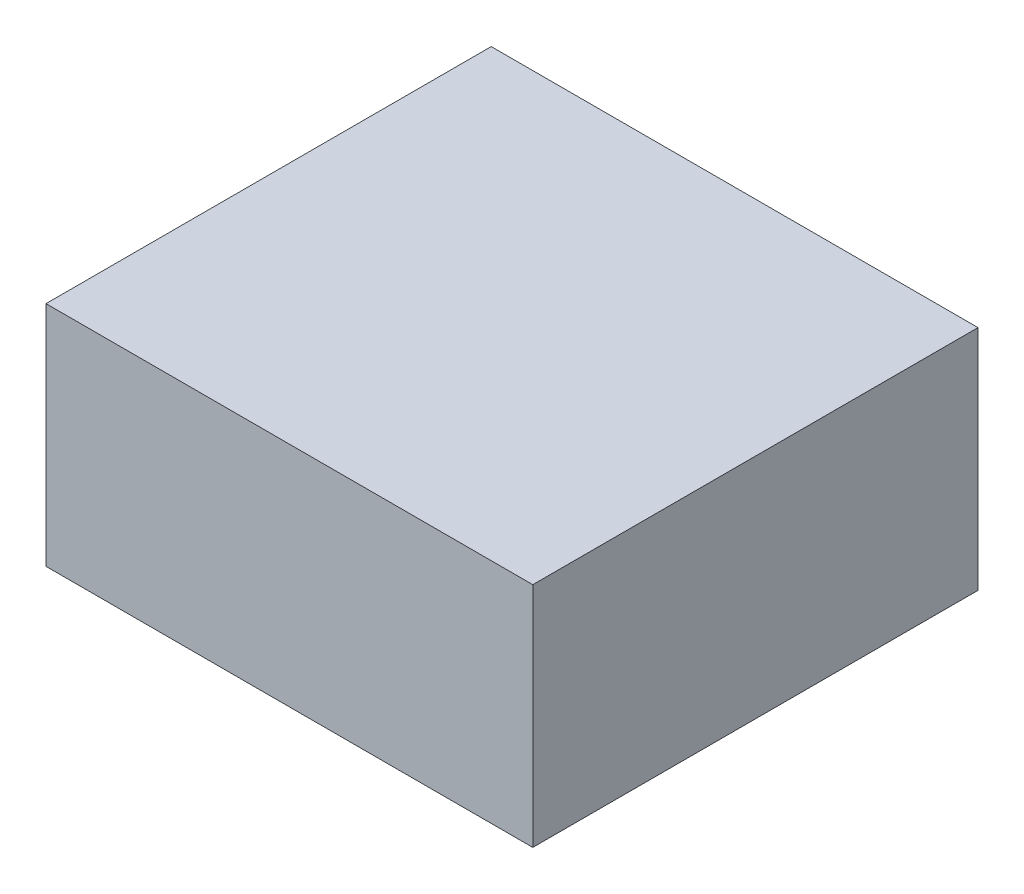
ISO-10303-21;
HEADER;
FILE_DESCRIPTION(('STEP AP214'),'2;1');
FILE_NAME('part.step','',(''),(''),'','','');
FILE_SCHEMA(('AUTOMOTIVE_DESIGN { 1 0 10303 214 1 1 1 1 }'));
ENDSEC;
DATA;
#1=APPLICATION_CONTEXT('core data for automotive mechanical design processes');
#2=APPLICATION_PROTOCOL_DEFINITION('international standard','automotive_design',2000,#1);
#3=PRODUCT_CONTEXT('',#1,'mechanical');
#4=PRODUCT('Part','Part','',(#3));
#5=PRODUCT_RELATED_PRODUCT_CATEGORY('part','',(#4));
#6=PRODUCT_DEFINITION_FORMATION('','',#4);
#7=PRODUCT_DEFINITION_CONTEXT('part definition',#1,'design');
#8=PRODUCT_DEFINITION('design','',#6,#7);
#9=PRODUCT_DEFINITION_SHAPE('','',#8);
#10=(LENGTH_UNIT() NAMED_UNIT(*) SI_UNIT(.MILLI.,.METRE.));
#11=(NAMED_UNIT(*) PLANE_ANGLE_UNIT() SI_UNIT($,.RADIAN.));
#12=(NAMED_UNIT(*) SI_UNIT($,.STERADIAN.) SOLID_ANGLE_UNIT());
#13=UNCERTAINTY_MEASURE_WITH_UNIT(LENGTH_MEASURE(1.E-05),#10,'distance_accuracy_value','');
#14=(GEOMETRIC_REPRESENTATION_CONTEXT(3) GLOBAL_UNCERTAINTY_ASSIGNED_CONTEXT((#13)) GLOBAL_UNIT_ASSIGNED_CONTEXT((#10,
#11,#12)) REPRESENTATION_CONTEXT('',''));
#15=CARTESIAN_POINT('',(0.,0.,0.));
#16=DIRECTION('',(0.,0.,1.));
#17=DIRECTION('',(1.,0.,0.));
#18=AXIS2_PLACEMENT_3D('',#15,#16,#17);
#19=CARTESIAN_POINT('',(-12.3,11.5,11.25));
#20=DIRECTION('',(1.,0.,0.));
#21=DIRECTION('',(0.,0.,-1.));
#22=AXIS2_PLACEMENT_3D('',#19,#20,#21);
#23=PLANE('',#22);
#24=DIRECTION('',(0.,0.,1.));
#25=VECTOR('',#24,1.);
#26=CARTESIAN_POINT('',(-12.3,0.,11.25));
#27=LINE('',#26,#25);
#28=CARTESIAN_POINT('',(-12.3,0.,-11.25));
#29=VERTEX_POINT('',#28);
#30=CARTESIAN_POINT('',(-12.3,0.,11.25));
#31=VERTEX_POINT('',#30);
#32=EDGE_CURVE('E96',#29,#31,#27,.T.);
#33=ORIENTED_EDGE('',*,*,#32,.T.);
#34=DIRECTION('',(0.,-1.,0.));
#35=VECTOR('',#34,1.);
#36=CARTESIAN_POINT('',(-12.3,11.5,11.25));
#37=LINE('',#36,#35);
#38=CARTESIAN_POINT('',(-12.3,11.5,11.25));
#39=VERTEX_POINT('',#38);
#40=EDGE_CURVE('E11',#39,#31,#37,.T.);
#41=ORIENTED_EDGE('',*,*,#40,.F.);
#42=DIRECTION('',(0.,0.,1.));
#43=VECTOR('',#42,1.);
#44=CARTESIAN_POINT('',(-12.3,11.5,11.25));
#45=LINE('',#44,#43);
#46=CARTESIAN_POINT('',(-12.3,11.5,-11.25));
#47=VERTEX_POINT('',#46);
#48=EDGE_CURVE('E84',#47,#39,#45,.T.);
#49=ORIENTED_EDGE('',*,*,#48,.F.);
#50=DIRECTION('',(0.,-1.,0.));
#51=VECTOR('',#50,1.);
#52=CARTESIAN_POINT('',(-12.3,11.5,-11.25));
#53=LINE('',#52,#51);
#54=EDGE_CURVE('E92',#47,#29,#53,.T.);
#55=ORIENTED_EDGE('',*,*,#54,.T.);
#56=EDGE_LOOP('',(#33,#41,#49,#55));
#57=FACE_BOUND('',#56,.T.);
#58=ADVANCED_FACE('F33',(#57),#23,.F.);
#59=CARTESIAN_POINT('',(12.3,11.5,11.25));
#60=DIRECTION('',(0.,0.,-1.));
#61=DIRECTION('',(-1.,0.,0.));
#62=AXIS2_PLACEMENT_3D('',#59,#60,#61);
#63=PLANE('',#62);
#64=DIRECTION('',(1.,0.,0.));
#65=VECTOR('',#64,1.);
#66=CARTESIAN_POINT('',(12.3,0.,11.25));
#67=LINE('',#66,#65);
#68=CARTESIAN_POINT('',(12.3,0.,11.25));
#69=VERTEX_POINT('',#68);
#70=EDGE_CURVE('E88',#31,#69,#67,.T.);
#71=ORIENTED_EDGE('',*,*,#70,.T.);
#72=DIRECTION('',(0.,-1.,0.));
#73=VECTOR('',#72,1.);
#74=CARTESIAN_POINT('',(12.3,11.5,11.25));
#75=LINE('',#74,#73);
#76=CARTESIAN_POINT('',(12.3,11.5,11.25));
#77=VERTEX_POINT('',#76);
#78=EDGE_CURVE('E41',#77,#69,#75,.T.);
#79=ORIENTED_EDGE('',*,*,#78,.F.);
#80=DIRECTION('',(1.,0.,0.));
#81=VECTOR('',#80,1.);
#82=CARTESIAN_POINT('',(12.3,11.5,11.25));
#83=LINE('',#82,#81);
#84=EDGE_CURVE('E79',#39,#77,#83,.T.);
#85=ORIENTED_EDGE('',*,*,#84,.F.);
#86=ORIENTED_EDGE('',*,*,#40,.T.);
#87=EDGE_LOOP('',(#71,#79,#85,#86));
#88=FACE_BOUND('',#87,.T.);
#89=ADVANCED_FACE('F87',(#88),#63,.F.);
#90=CARTESIAN_POINT('',(12.3,11.5,11.25));
#91=DIRECTION('',(-1.,0.,0.));
#92=DIRECTION('',(0.,0.,1.));
#93=AXIS2_PLACEMENT_3D('',#90,#91,#92);
#94=PLANE('',#93);
#95=DIRECTION('',(0.,0.,-1.));
#96=VECTOR('',#95,1.);
#97=CARTESIAN_POINT('',(12.3,0.,11.25));
#98=LINE('',#97,#96);
#99=CARTESIAN_POINT('',(12.3,0.,-11.25));
#100=VERTEX_POINT('',#99);
#101=EDGE_CURVE('E66',#69,#100,#98,.T.);
#102=ORIENTED_EDGE('',*,*,#101,.T.);
#103=DIRECTION('',(0.,-1.,0.));
#104=VECTOR('',#103,1.);
#105=CARTESIAN_POINT('',(12.3,11.5,-11.25));
#106=LINE('',#105,#104);
#107=CARTESIAN_POINT('',(12.3,11.5,-11.25));
#108=VERTEX_POINT('',#107);
#109=EDGE_CURVE('E89',#108,#100,#106,.T.);
#110=ORIENTED_EDGE('',*,*,#109,.F.);
#111=DIRECTION('',(0.,0.,-1.));
#112=VECTOR('',#111,1.);
#113=CARTESIAN_POINT('',(12.3,11.5,11.25));
#114=LINE('',#113,#112);
#115=EDGE_CURVE('E82',#77,#108,#114,.T.);
#116=ORIENTED_EDGE('',*,*,#115,.F.);
#117=ORIENTED_EDGE('',*,*,#78,.T.);
#118=EDGE_LOOP('',(#102,#110,#116,#117));
#119=FACE_BOUND('',#118,.T.);
#120=ADVANCED_FACE('F90',(#119),#94,.F.);
#121=CARTESIAN_POINT('',(12.3,11.5,-11.25));
#122=DIRECTION('',(0.,0.,1.));
#123=DIRECTION('',(1.,0.,0.));
#124=AXIS2_PLACEMENT_3D('',#121,#122,#123);
#125=PLANE('',#124);
#126=DIRECTION('',(-1.,0.,0.));
#127=VECTOR('',#126,1.);
#128=CARTESIAN_POINT('',(12.3,0.,-11.25));
#129=LINE('',#128,#127);
#130=EDGE_CURVE('E72',#100,#29,#129,.T.);
#131=ORIENTED_EDGE('',*,*,#130,.T.);
#132=ORIENTED_EDGE('',*,*,#54,.F.);
#133=DIRECTION('',(-1.,0.,0.));
#134=VECTOR('',#133,1.);
#135=CARTESIAN_POINT('',(12.3,11.5,-11.25));
#136=LINE('',#135,#134);
#137=EDGE_CURVE('E49',#108,#47,#136,.T.);
#138=ORIENTED_EDGE('',*,*,#137,.F.);
#139=ORIENTED_EDGE('',*,*,#109,.T.);
#140=EDGE_LOOP('',(#131,#132,#138,#139));
#141=FACE_BOUND('',#140,.T.);
#142=ADVANCED_FACE('F103',(#141),#125,.F.);
#143=CARTESIAN_POINT('',(0.,11.5,0.));
#144=DIRECTION('',(0.,1.,0.));
#145=DIRECTION('',(0.,0.,1.));
#146=AXIS2_PLACEMENT_3D('',#143,#144,#145);
#147=PLANE('',#146);
#148=ORIENTED_EDGE('',*,*,#48,.T.);
#149=ORIENTED_EDGE('',*,*,#84,.T.);
#150=ORIENTED_EDGE('',*,*,#115,.T.);
#151=ORIENTED_EDGE('',*,*,#137,.T.);
#152=EDGE_LOOP('',(#148,#149,#150,#151));
#153=FACE_BOUND('',#152,.T.);
#154=ADVANCED_FACE('F80',(#153),#147,.T.);
#155=CARTESIAN_POINT('',(0.,0.,0.));
#156=DIRECTION('',(0.,1.,0.));
#157=DIRECTION('',(0.,0.,1.));
#158=AXIS2_PLACEMENT_3D('',#155,#156,#157);
#159=PLANE('',#158);
#160=ORIENTED_EDGE('',*,*,#32,.F.);
#161=ORIENTED_EDGE('',*,*,#130,.F.);
#162=ORIENTED_EDGE('',*,*,#101,.F.);
#163=ORIENTED_EDGE('',*,*,#70,.F.);
#164=EDGE_LOOP('',(#160,#161,#162,#163));
#165=FACE_BOUND('',#164,.T.);
#166=ADVANCED_FACE('F106',(#165),#159,.F.);
#167=CLOSED_SHELL('',(#58,#89,#120,#142,#154,#166));
#168=MANIFOLD_SOLID_BREP('B2',#167);
#169=ADVANCED_BREP_SHAPE_REPRESENTATION('',(#18,#168),#14);
#170=SHAPE_DEFINITION_REPRESENTATION(#9,#169);
ENDSEC;
END-ISO-10303-21;
